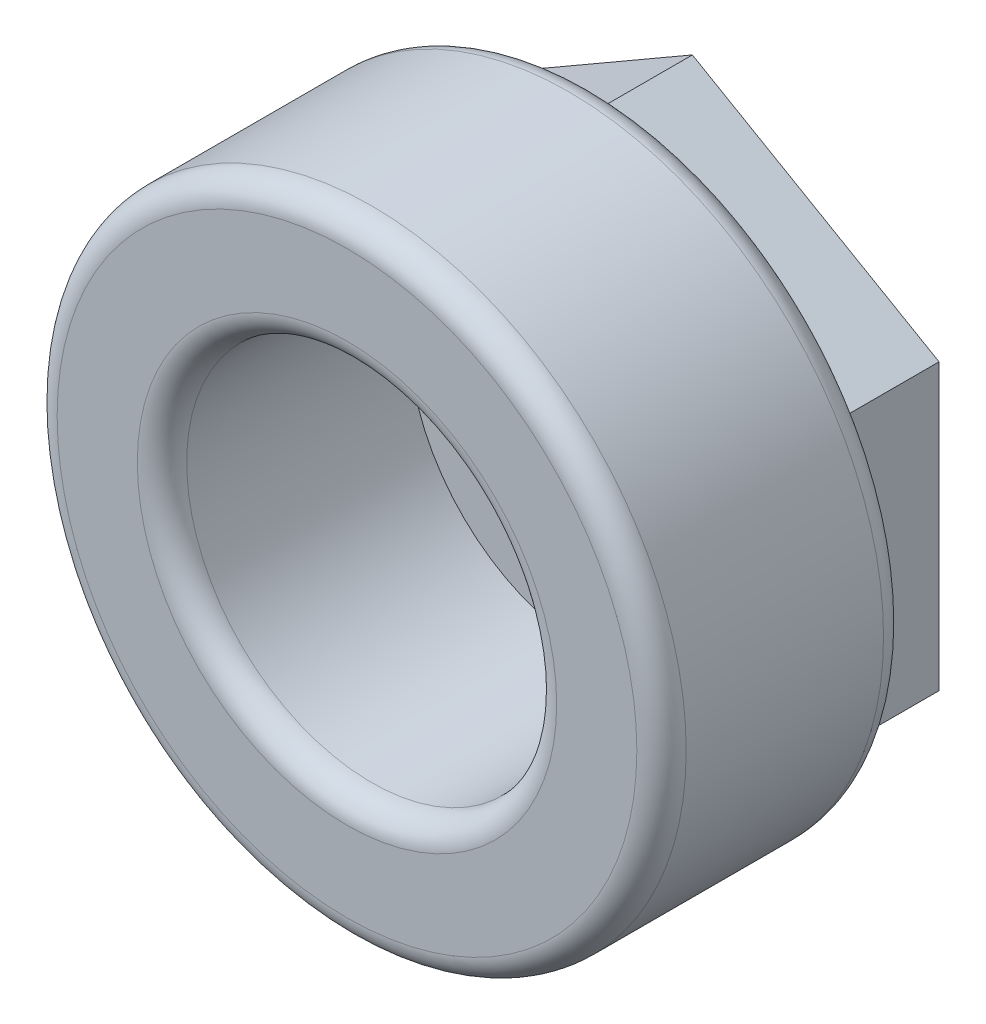
ISO-10303-21;
HEADER;
FILE_DESCRIPTION(('STEP AP214'),'2;1');
FILE_NAME('part.step','',(''),(''),'','','');
FILE_SCHEMA(('AUTOMOTIVE_DESIGN { 1 0 10303 214 1 1 1 1 }'));
ENDSEC;
DATA;
#1=APPLICATION_CONTEXT('core data for automotive mechanical design processes');
#2=APPLICATION_PROTOCOL_DEFINITION('international standard','automotive_design',2000,#1);
#3=PRODUCT_CONTEXT('',#1,'mechanical');
#4=PRODUCT('Part','Part','',(#3));
#5=PRODUCT_RELATED_PRODUCT_CATEGORY('part','',(#4));
#6=PRODUCT_DEFINITION_FORMATION('','',#4);
#7=PRODUCT_DEFINITION_CONTEXT('part definition',#1,'design');
#8=PRODUCT_DEFINITION('design','',#6,#7);
#9=PRODUCT_DEFINITION_SHAPE('','',#8);
#10=(LENGTH_UNIT() NAMED_UNIT(*) SI_UNIT(.MILLI.,.METRE.));
#11=(NAMED_UNIT(*) PLANE_ANGLE_UNIT() SI_UNIT($,.RADIAN.));
#12=(NAMED_UNIT(*) SI_UNIT($,.STERADIAN.) SOLID_ANGLE_UNIT());
#13=UNCERTAINTY_MEASURE_WITH_UNIT(LENGTH_MEASURE(1.E-05),#10,'distance_accuracy_value','');
#14=(GEOMETRIC_REPRESENTATION_CONTEXT(3) GLOBAL_UNCERTAINTY_ASSIGNED_CONTEXT((#13)) GLOBAL_UNIT_ASSIGNED_CONTEXT((#10,
#11,#12)) REPRESENTATION_CONTEXT('',''));
#15=CARTESIAN_POINT('',(0.,0.,0.));
#16=DIRECTION('',(0.,0.,1.));
#17=DIRECTION('',(1.,0.,0.));
#18=AXIS2_PLACEMENT_3D('',#15,#16,#17);
#19=CARTESIAN_POINT('',(-2.,-1.15470053837925,0.8));
#20=DIRECTION('',(0.5,0.866025403784439,0.));
#21=DIRECTION('',(-0.866025403784439,0.5,0.));
#22=AXIS2_PLACEMENT_3D('',#19,#20,#21);
#23=PLANE('',#22);
#24=DIRECTION('',(0.866025403784439,-0.5,0.));
#25=VECTOR('',#24,1.);
#26=CARTESIAN_POINT('',(-2.,-1.15470053837925,0.));
#27=LINE('',#26,#25);
#28=CARTESIAN_POINT('',(-2.,-1.15470053837925,0.));
#29=VERTEX_POINT('',#28);
#30=CARTESIAN_POINT('',(0.,-2.3094010767585,0.));
#31=VERTEX_POINT('',#30);
#32=EDGE_CURVE('E129',#29,#31,#27,.T.);
#33=ORIENTED_EDGE('',*,*,#32,.T.);
#34=DIRECTION('',(0.,0.,-1.));
#35=VECTOR('',#34,1.);
#36=CARTESIAN_POINT('',(0.,-2.3094010767585,0.8));
#37=LINE('',#36,#35);
#38=CARTESIAN_POINT('',(0.,-2.3094010767585,0.8));
#39=VERTEX_POINT('',#38);
#40=EDGE_CURVE('E144',#39,#31,#37,.T.);
#41=ORIENTED_EDGE('',*,*,#40,.F.);
#42=DIRECTION('',(0.866025403784439,-0.5,0.));
#43=VECTOR('',#42,1.);
#44=CARTESIAN_POINT('',(-2.,-1.15470053837925,0.8));
#45=LINE('',#44,#43);
#46=CARTESIAN_POINT('',(-2.,-1.15470053837925,0.8));
#47=VERTEX_POINT('',#46);
#48=EDGE_CURVE('E121',#47,#39,#45,.T.);
#49=ORIENTED_EDGE('',*,*,#48,.F.);
#50=DIRECTION('',(0.,0.,-1.));
#51=VECTOR('',#50,1.);
#52=CARTESIAN_POINT('',(-2.,-1.15470053837925,0.8));
#53=LINE('',#52,#51);
#54=EDGE_CURVE('E128',#47,#29,#53,.T.);
#55=ORIENTED_EDGE('',*,*,#54,.T.);
#56=EDGE_LOOP('',(#33,#41,#49,#55));
#57=FACE_BOUND('',#56,.T.);
#58=ADVANCED_FACE('F35',(#57),#23,.F.);
#59=CARTESIAN_POINT('',(0.,-2.3094010767585,0.8));
#60=DIRECTION('',(-0.5,0.866025403784439,0.));
#61=DIRECTION('',(-0.866025403784439,-0.5,0.));
#62=AXIS2_PLACEMENT_3D('',#59,#60,#61);
#63=PLANE('',#62);
#64=DIRECTION('',(0.866025403784439,0.5,0.));
#65=VECTOR('',#64,1.);
#66=CARTESIAN_POINT('',(0.,-2.3094010767585,0.));
#67=LINE('',#66,#65);
#68=CARTESIAN_POINT('',(2.,-1.15470053837925,0.));
#69=VERTEX_POINT('',#68);
#70=EDGE_CURVE('E132',#31,#69,#67,.T.);
#71=ORIENTED_EDGE('',*,*,#70,.T.);
#72=DIRECTION('',(0.,0.,-1.));
#73=VECTOR('',#72,1.);
#74=CARTESIAN_POINT('',(2.,-1.15470053837925,0.8));
#75=LINE('',#74,#73);
#76=CARTESIAN_POINT('',(2.,-1.15470053837925,0.8));
#77=VERTEX_POINT('',#76);
#78=EDGE_CURVE('E107',#77,#69,#75,.T.);
#79=ORIENTED_EDGE('',*,*,#78,.F.);
#80=DIRECTION('',(0.866025403784439,0.5,0.));
#81=VECTOR('',#80,1.);
#82=CARTESIAN_POINT('',(0.,-2.3094010767585,0.8));
#83=LINE('',#82,#81);
#84=EDGE_CURVE('E89',#39,#77,#83,.T.);
#85=ORIENTED_EDGE('',*,*,#84,.F.);
#86=ORIENTED_EDGE('',*,*,#40,.T.);
#87=EDGE_LOOP('',(#71,#79,#85,#86));
#88=FACE_BOUND('',#87,.T.);
#89=ADVANCED_FACE('F180',(#88),#63,.F.);
#90=CARTESIAN_POINT('',(2.,-1.15470053837925,0.8));
#91=DIRECTION('',(-1.,0.,0.));
#92=DIRECTION('',(0.,0.,1.));
#93=AXIS2_PLACEMENT_3D('',#90,#91,#92);
#94=PLANE('',#93);
#95=DIRECTION('',(0.,1.,0.));
#96=VECTOR('',#95,1.);
#97=CARTESIAN_POINT('',(2.,-1.15470053837925,0.));
#98=LINE('',#97,#96);
#99=CARTESIAN_POINT('',(2.,1.15470053837925,0.));
#100=VERTEX_POINT('',#99);
#101=EDGE_CURVE('E104',#69,#100,#98,.T.);
#102=ORIENTED_EDGE('',*,*,#101,.T.);
#103=DIRECTION('',(0.,0.,-1.));
#104=VECTOR('',#103,1.);
#105=CARTESIAN_POINT('',(2.,1.15470053837925,0.8));
#106=LINE('',#105,#104);
#107=CARTESIAN_POINT('',(2.,1.15470053837925,0.8));
#108=VERTEX_POINT('',#107);
#109=EDGE_CURVE('E97',#108,#100,#106,.T.);
#110=ORIENTED_EDGE('',*,*,#109,.F.);
#111=DIRECTION('',(0.,1.,0.));
#112=VECTOR('',#111,1.);
#113=CARTESIAN_POINT('',(2.,-1.15470053837925,0.8));
#114=LINE('',#113,#112);
#115=EDGE_CURVE('E102',#77,#108,#114,.T.);
#116=ORIENTED_EDGE('',*,*,#115,.F.);
#117=ORIENTED_EDGE('',*,*,#78,.T.);
#118=EDGE_LOOP('',(#102,#110,#116,#117));
#119=FACE_BOUND('',#118,.T.);
#120=ADVANCED_FACE('F99',(#119),#94,.F.);
#121=CARTESIAN_POINT('',(2.,1.15470053837925,0.8));
#122=DIRECTION('',(-0.5,-0.866025403784439,0.));
#123=DIRECTION('',(0.866025403784439,-0.5,0.));
#124=AXIS2_PLACEMENT_3D('',#121,#122,#123);
#125=PLANE('',#124);
#126=DIRECTION('',(-0.866025403784439,0.5,0.));
#127=VECTOR('',#126,1.);
#128=CARTESIAN_POINT('',(2.,1.15470053837925,0.));
#129=LINE('',#128,#127);
#130=CARTESIAN_POINT('',(0.,2.3094010767585,0.));
#131=VERTEX_POINT('',#130);
#132=EDGE_CURVE('E136',#100,#131,#129,.T.);
#133=ORIENTED_EDGE('',*,*,#132,.T.);
#134=DIRECTION('',(0.,0.,-1.));
#135=VECTOR('',#134,1.);
#136=CARTESIAN_POINT('',(0.,2.3094010767585,0.8));
#137=LINE('',#136,#135);
#138=CARTESIAN_POINT('',(0.,2.3094010767585,0.8));
#139=VERTEX_POINT('',#138);
#140=EDGE_CURVE('E108',#139,#131,#137,.T.);
#141=ORIENTED_EDGE('',*,*,#140,.F.);
#142=DIRECTION('',(-0.866025403784439,0.5,0.));
#143=VECTOR('',#142,1.);
#144=CARTESIAN_POINT('',(2.,1.15470053837925,0.8));
#145=LINE('',#144,#143);
#146=EDGE_CURVE('E111',#108,#139,#145,.T.);
#147=ORIENTED_EDGE('',*,*,#146,.F.);
#148=ORIENTED_EDGE('',*,*,#109,.T.);
#149=EDGE_LOOP('',(#133,#141,#147,#148));
#150=FACE_BOUND('',#149,.T.);
#151=ADVANCED_FACE('F112',(#150),#125,.F.);
#152=CARTESIAN_POINT('',(0.,2.3094010767585,0.8));
#153=DIRECTION('',(0.5,-0.866025403784439,0.));
#154=DIRECTION('',(0.866025403784439,0.5,0.));
#155=AXIS2_PLACEMENT_3D('',#152,#153,#154);
#156=PLANE('',#155);
#157=DIRECTION('',(-0.866025403784439,-0.5,0.));
#158=VECTOR('',#157,1.);
#159=CARTESIAN_POINT('',(0.,2.3094010767585,0.));
#160=LINE('',#159,#158);
#161=CARTESIAN_POINT('',(-2.,1.15470053837925,0.));
#162=VERTEX_POINT('',#161);
#163=EDGE_CURVE('E74',#131,#162,#160,.T.);
#164=ORIENTED_EDGE('',*,*,#163,.T.);
#165=DIRECTION('',(0.,0.,-1.));
#166=VECTOR('',#165,1.);
#167=CARTESIAN_POINT('',(-2.,1.15470053837925,0.8));
#168=LINE('',#167,#166);
#169=CARTESIAN_POINT('',(-2.,1.15470053837925,0.8));
#170=VERTEX_POINT('',#169);
#171=EDGE_CURVE('E52',#170,#162,#168,.T.);
#172=ORIENTED_EDGE('',*,*,#171,.F.);
#173=DIRECTION('',(-0.866025403784439,-0.5,0.));
#174=VECTOR('',#173,1.);
#175=CARTESIAN_POINT('',(0.,2.3094010767585,0.8));
#176=LINE('',#175,#174);
#177=EDGE_CURVE('E115',#139,#170,#176,.T.);
#178=ORIENTED_EDGE('',*,*,#177,.F.);
#179=ORIENTED_EDGE('',*,*,#140,.T.);
#180=EDGE_LOOP('',(#164,#172,#178,#179));
#181=FACE_BOUND('',#180,.T.);
#182=ADVANCED_FACE('F192',(#181),#156,.F.);
#183=CARTESIAN_POINT('',(-2.,1.15470053837925,0.8));
#184=DIRECTION('',(1.,0.,0.));
#185=DIRECTION('',(0.,1.,0.));
#186=AXIS2_PLACEMENT_3D('',#183,#184,#185);
#187=PLANE('',#186);
#188=DIRECTION('',(0.,-1.,0.));
#189=VECTOR('',#188,1.);
#190=CARTESIAN_POINT('',(-2.,1.15470053837925,0.));
#191=LINE('',#190,#189);
#192=EDGE_CURVE('E80',#162,#29,#191,.T.);
#193=ORIENTED_EDGE('',*,*,#192,.T.);
#194=ORIENTED_EDGE('',*,*,#54,.F.);
#195=DIRECTION('',(0.,-1.,0.));
#196=VECTOR('',#195,1.);
#197=CARTESIAN_POINT('',(-2.,1.15470053837925,0.8));
#198=LINE('',#197,#196);
#199=EDGE_CURVE('E126',#170,#47,#198,.T.);
#200=ORIENTED_EDGE('',*,*,#199,.F.);
#201=ORIENTED_EDGE('',*,*,#171,.T.);
#202=EDGE_LOOP('',(#193,#194,#200,#201));
#203=FACE_BOUND('',#202,.T.);
#204=ADVANCED_FACE('F195',(#203),#187,.F.);
#205=CARTESIAN_POINT('',(0.,0.,0.));
#206=DIRECTION('',(0.,0.,1.));
#207=DIRECTION('',(1.,0.,0.));
#208=AXIS2_PLACEMENT_3D('',#205,#206,#207);
#209=PLANE('',#208);
#210=CARTESIAN_POINT('',(0.,0.,0.));
#211=DIRECTION('',(0.,0.,1.));
#212=DIRECTION('',(1.,0.,0.));
#213=AXIS2_PLACEMENT_3D('',#210,#211,#212);
#214=CIRCLE('',#213,1.);
#215=CARTESIAN_POINT('',(1.,0.,0.));
#216=VERTEX_POINT('',#215);
#217=EDGE_CURVE('E133',#216,#216,#214,.T.);
#218=ORIENTED_EDGE('',*,*,#217,.T.);
#219=EDGE_LOOP('',(#218));
#220=FACE_BOUND('',#219,.T.);
#221=ORIENTED_EDGE('',*,*,#32,.F.);
#222=ORIENTED_EDGE('',*,*,#192,.F.);
#223=ORIENTED_EDGE('',*,*,#163,.F.);
#224=ORIENTED_EDGE('',*,*,#132,.F.);
#225=ORIENTED_EDGE('',*,*,#101,.F.);
#226=ORIENTED_EDGE('',*,*,#70,.F.);
#227=EDGE_LOOP('',(#221,#222,#223,#224,#225,#226));
#228=FACE_BOUND('',#227,.T.);
#229=ADVANCED_FACE('F198',(#220,#228),#209,.F.);
#230=CARTESIAN_POINT('',(0.,0.,0.8));
#231=DIRECTION('',(0.,0.,1.));
#232=DIRECTION('',(1.,0.,0.));
#233=AXIS2_PLACEMENT_3D('',#230,#231,#232);
#234=PLANE('',#233);
#235=CARTESIAN_POINT('',(0.,0.,0.8));
#236=DIRECTION('',(0.,0.,1.));
#237=DIRECTION('',(1.,0.,0.));
#238=AXIS2_PLACEMENT_3D('',#235,#236,#237);
#239=CIRCLE('',#238,2.35);
#240=CARTESIAN_POINT('',(2.35,0.,0.8));
#241=VERTEX_POINT('',#240);
#242=EDGE_CURVE('E155',#241,#241,#239,.F.);
#243=ORIENTED_EDGE('',*,*,#242,.T.);
#244=EDGE_LOOP('',(#243));
#245=FACE_BOUND('',#244,.T.);
#246=ORIENTED_EDGE('',*,*,#199,.T.);
#247=ORIENTED_EDGE('',*,*,#48,.T.);
#248=ORIENTED_EDGE('',*,*,#84,.T.);
#249=ORIENTED_EDGE('',*,*,#115,.T.);
#250=ORIENTED_EDGE('',*,*,#146,.T.);
#251=ORIENTED_EDGE('',*,*,#177,.T.);
#252=EDGE_LOOP('',(#246,#247,#248,#249,#250,#251));
#253=FACE_BOUND('',#252,.T.);
#254=ADVANCED_FACE('F118',(#245,#253),#234,.F.);
#255=CARTESIAN_POINT('',(0.,0.,2.8));
#256=DIRECTION('',(0.,0.,1.));
#257=DIRECTION('',(1.,0.,0.));
#258=AXIS2_PLACEMENT_3D('',#255,#256,#257);
#259=PLANE('',#258);
#260=CARTESIAN_POINT('',(0.,0.,2.8));
#261=DIRECTION('',(0.,0.,1.));
#262=DIRECTION('',(1.,0.,0.));
#263=AXIS2_PLACEMENT_3D('',#260,#261,#262);
#264=CIRCLE('',#263,2.35);
#265=CARTESIAN_POINT('',(2.35,0.,2.8));
#266=VERTEX_POINT('',#265);
#267=EDGE_CURVE('E44',#266,#266,#264,.T.);
#268=ORIENTED_EDGE('',*,*,#267,.T.);
#269=EDGE_LOOP('',(#268));
#270=FACE_BOUND('',#269,.T.);
#271=CARTESIAN_POINT('',(0.,0.,2.8));
#272=DIRECTION('',(0.,0.,1.));
#273=DIRECTION('',(1.,0.,0.));
#274=AXIS2_PLACEMENT_3D('',#271,#272,#273);
#275=CIRCLE('',#274,1.7);
#276=CARTESIAN_POINT('',(1.7,0.,2.8));
#277=VERTEX_POINT('',#276);
#278=EDGE_CURVE('E158',#277,#277,#275,.F.);
#279=ORIENTED_EDGE('',*,*,#278,.T.);
#280=EDGE_LOOP('',(#279));
#281=FACE_BOUND('',#280,.T.);
#282=ADVANCED_FACE('F163',(#270,#281),#259,.T.);
#283=CARTESIAN_POINT('',(0.,0.,2.8));
#284=DIRECTION('',(0.,0.,-1.));
#285=DIRECTION('',(-1.,0.,0.));
#286=AXIS2_PLACEMENT_3D('',#283,#284,#285);
#287=CYLINDRICAL_SURFACE('',#286,2.55);
#288=CARTESIAN_POINT('',(0.,0.,1.));
#289=DIRECTION('',(0.,0.,1.));
#290=DIRECTION('',(1.,0.,0.));
#291=AXIS2_PLACEMENT_3D('',#288,#289,#290);
#292=CIRCLE('',#291,2.55);
#293=CARTESIAN_POINT('',(2.55,0.,1.));
#294=VERTEX_POINT('',#293);
#295=EDGE_CURVE('E152',#294,#294,#292,.T.);
#296=ORIENTED_EDGE('',*,*,#295,.T.);
#297=EDGE_LOOP('',(#296));
#298=FACE_BOUND('',#297,.T.);
#299=CARTESIAN_POINT('',(0.,0.,2.6));
#300=DIRECTION('',(0.,0.,1.));
#301=DIRECTION('',(1.,0.,0.));
#302=AXIS2_PLACEMENT_3D('',#299,#300,#301);
#303=CIRCLE('',#302,2.55);
#304=CARTESIAN_POINT('',(2.55,0.,2.6));
#305=VERTEX_POINT('',#304);
#306=EDGE_CURVE('E149',#305,#305,#303,.F.);
#307=ORIENTED_EDGE('',*,*,#306,.T.);
#308=EDGE_LOOP('',(#307));
#309=FACE_BOUND('',#308,.T.);
#310=ADVANCED_FACE('F207',(#298,#309),#287,.T.);
#311=CARTESIAN_POINT('',(0.,0.,2.8));
#312=DIRECTION('',(0.,0.,-1.));
#313=DIRECTION('',(-1.,0.,0.));
#314=AXIS2_PLACEMENT_3D('',#311,#312,#313);
#315=CYLINDRICAL_SURFACE('',#314,1.5);
#316=CARTESIAN_POINT('',(0.,0.,2.6));
#317=DIRECTION('',(0.,0.,1.));
#318=DIRECTION('',(1.,0.,0.));
#319=AXIS2_PLACEMENT_3D('',#316,#317,#318);
#320=CIRCLE('',#319,1.5);
#321=CARTESIAN_POINT('',(1.5,0.,2.6));
#322=VERTEX_POINT('',#321);
#323=EDGE_CURVE('E11',#322,#322,#320,.T.);
#324=ORIENTED_EDGE('',*,*,#323,.T.);
#325=EDGE_LOOP('',(#324));
#326=FACE_BOUND('',#325,.T.);
#327=CARTESIAN_POINT('',(0.,0.,0.8));
#328=DIRECTION('',(0.,0.,1.));
#329=DIRECTION('',(1.,0.,0.));
#330=AXIS2_PLACEMENT_3D('',#327,#328,#329);
#331=CIRCLE('',#330,1.5);
#332=CARTESIAN_POINT('',(1.5,0.,0.8));
#333=VERTEX_POINT('',#332);
#334=EDGE_CURVE('E146',#333,#333,#331,.F.);
#335=ORIENTED_EDGE('',*,*,#334,.T.);
#336=EDGE_LOOP('',(#335));
#337=FACE_BOUND('',#336,.T.);
#338=ADVANCED_FACE('F205',(#326,#337),#315,.F.);
#339=CARTESIAN_POINT('',(0.,0.,0.8));
#340=DIRECTION('',(0.,0.,1.));
#341=DIRECTION('',(1.,0.,0.));
#342=AXIS2_PLACEMENT_3D('',#339,#340,#341);
#343=PLANE('',#342);
#344=CARTESIAN_POINT('',(0.,0.,0.8));
#345=DIRECTION('',(0.,0.,1.));
#346=DIRECTION('',(1.,0.,0.));
#347=AXIS2_PLACEMENT_3D('',#344,#345,#346);
#348=CIRCLE('',#347,1.);
#349=CARTESIAN_POINT('',(1.,0.,0.8));
#350=VERTEX_POINT('',#349);
#351=EDGE_CURVE('E228',#350,#350,#348,.T.);
#352=ORIENTED_EDGE('',*,*,#351,.F.);
#353=EDGE_LOOP('',(#352));
#354=FACE_BOUND('',#353,.T.);
#355=ORIENTED_EDGE('',*,*,#334,.F.);
#356=EDGE_LOOP('',(#355));
#357=FACE_BOUND('',#356,.T.);
#358=ADVANCED_FACE('F202',(#354,#357),#343,.T.);
#359=CARTESIAN_POINT('',(0.,0.,0.));
#360=DIRECTION('',(0.,0.,1.));
#361=DIRECTION('',(1.,0.,0.));
#362=AXIS2_PLACEMENT_3D('',#359,#360,#361);
#363=CYLINDRICAL_SURFACE('',#362,1.);
#364=ORIENTED_EDGE('',*,*,#217,.F.);
#365=EDGE_LOOP('',(#364));
#366=FACE_BOUND('',#365,.T.);
#367=ORIENTED_EDGE('',*,*,#351,.T.);
#368=EDGE_LOOP('',(#367));
#369=FACE_BOUND('',#368,.T.);
#370=ADVANCED_FACE('F175',(#366,#369),#363,.F.);
#371=CARTESIAN_POINT('',(0.,0.,1.));
#372=DIRECTION('',(0.,0.,1.));
#373=DIRECTION('',(1.,0.,0.));
#374=AXIS2_PLACEMENT_3D('',#371,#372,#373);
#375=TOROIDAL_SURFACE('',#374,2.35,0.2);
#376=ORIENTED_EDGE('',*,*,#242,.F.);
#377=EDGE_LOOP('',(#376));
#378=FACE_BOUND('',#377,.T.);
#379=ORIENTED_EDGE('',*,*,#295,.F.);
#380=EDGE_LOOP('',(#379));
#381=FACE_BOUND('',#380,.T.);
#382=ADVANCED_FACE('F168',(#378,#381),#375,.T.);
#383=CARTESIAN_POINT('',(0.,0.,2.6));
#384=DIRECTION('',(0.,0.,1.));
#385=DIRECTION('',(1.,0.,0.));
#386=AXIS2_PLACEMENT_3D('',#383,#384,#385);
#387=TOROIDAL_SURFACE('',#386,2.35,0.2);
#388=ORIENTED_EDGE('',*,*,#306,.F.);
#389=EDGE_LOOP('',(#388));
#390=FACE_BOUND('',#389,.T.);
#391=ORIENTED_EDGE('',*,*,#267,.F.);
#392=EDGE_LOOP('',(#391));
#393=FACE_BOUND('',#392,.T.);
#394=ADVANCED_FACE('F166',(#390,#393),#387,.T.);
#395=CARTESIAN_POINT('',(0.,0.,2.6));
#396=DIRECTION('',(0.,0.,1.));
#397=DIRECTION('',(1.,0.,0.));
#398=AXIS2_PLACEMENT_3D('',#395,#396,#397);
#399=TOROIDAL_SURFACE('',#398,1.7,0.2);
#400=ORIENTED_EDGE('',*,*,#278,.F.);
#401=EDGE_LOOP('',(#400));
#402=FACE_BOUND('',#401,.T.);
#403=ORIENTED_EDGE('',*,*,#323,.F.);
#404=EDGE_LOOP('',(#403));
#405=FACE_BOUND('',#404,.T.);
#406=ADVANCED_FACE('F37',(#402,#405),#399,.T.);
#407=CLOSED_SHELL('',(#58,#89,#120,#151,#182,#204,#229,#254,#282,#310,#338,#358,#370,#382,#394,#406));
#408=MANIFOLD_SOLID_BREP('B2',#407);
#409=ADVANCED_BREP_SHAPE_REPRESENTATION('',(#18,#408),#14);
#410=SHAPE_DEFINITION_REPRESENTATION(#9,#409);
ENDSEC;
END-ISO-10303-21;
